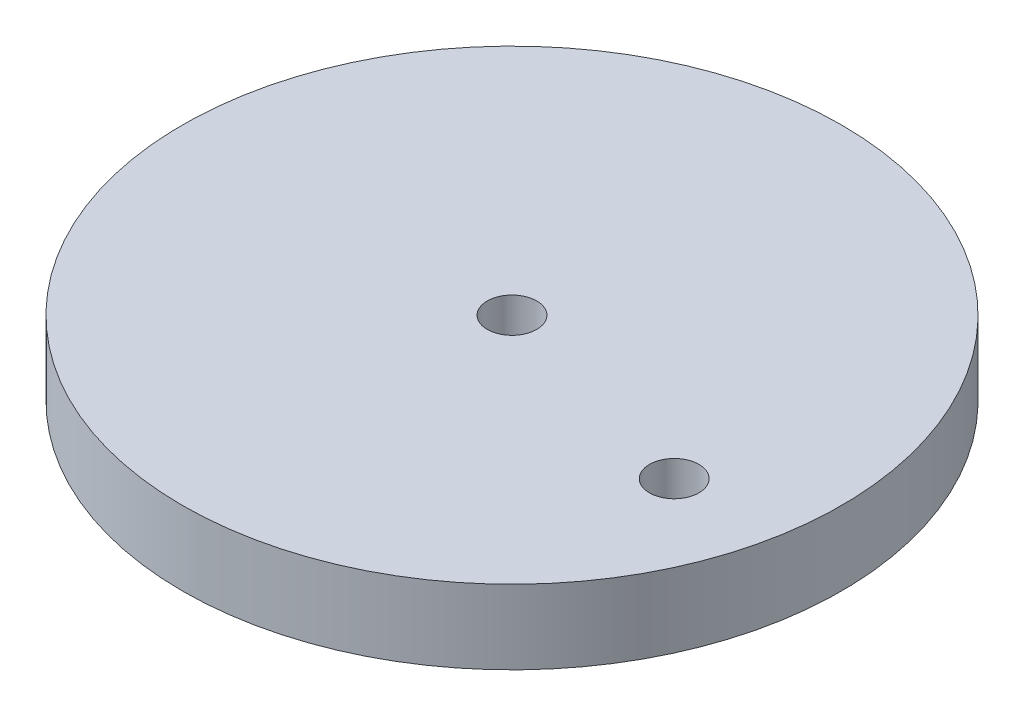
ISO-10303-21;
HEADER;
FILE_DESCRIPTION(('STEP AP214'),'2;1');
FILE_NAME('part.step','',(''),(''),'','','');
FILE_SCHEMA(('AUTOMOTIVE_DESIGN { 1 0 10303 214 1 1 1 1 }'));
ENDSEC;
DATA;
#1=APPLICATION_CONTEXT('core data for automotive mechanical design processes');
#2=APPLICATION_PROTOCOL_DEFINITION('international standard','automotive_design',2000,#1);
#3=PRODUCT_CONTEXT('',#1,'mechanical');
#4=PRODUCT('Part','Part','',(#3));
#5=PRODUCT_RELATED_PRODUCT_CATEGORY('part','',(#4));
#6=PRODUCT_DEFINITION_FORMATION('','',#4);
#7=PRODUCT_DEFINITION_CONTEXT('part definition',#1,'design');
#8=PRODUCT_DEFINITION('design','',#6,#7);
#9=PRODUCT_DEFINITION_SHAPE('','',#8);
#10=(LENGTH_UNIT() NAMED_UNIT(*) SI_UNIT(.MILLI.,.METRE.));
#11=(NAMED_UNIT(*) PLANE_ANGLE_UNIT() SI_UNIT($,.RADIAN.));
#12=(NAMED_UNIT(*) SI_UNIT($,.STERADIAN.) SOLID_ANGLE_UNIT());
#13=UNCERTAINTY_MEASURE_WITH_UNIT(LENGTH_MEASURE(1.E-05),#10,'distance_accuracy_value','');
#14=(GEOMETRIC_REPRESENTATION_CONTEXT(3) GLOBAL_UNCERTAINTY_ASSIGNED_CONTEXT((#13)) GLOBAL_UNIT_ASSIGNED_CONTEXT((#10,
#11,#12)) REPRESENTATION_CONTEXT('',''));
#15=CARTESIAN_POINT('',(0.,0.,0.));
#16=DIRECTION('',(0.,0.,1.));
#17=DIRECTION('',(1.,0.,0.));
#18=AXIS2_PLACEMENT_3D('',#15,#16,#17);
#19=CARTESIAN_POINT('',(0.,2.25,0.));
#20=DIRECTION('',(0.,1.,0.));
#21=DIRECTION('',(0.,0.,1.));
#22=AXIS2_PLACEMENT_3D('',#19,#20,#21);
#23=PLANE('',#22);
#24=CARTESIAN_POINT('',(0.,2.25,0.));
#25=DIRECTION('',(0.,1.,0.));
#26=DIRECTION('',(0.,0.,1.));
#27=AXIS2_PLACEMENT_3D('',#24,#25,#26);
#28=CIRCLE('',#27,1.5);
#29=CARTESIAN_POINT('',(0.,2.25,1.5));
#30=VERTEX_POINT('',#29);
#31=EDGE_CURVE('E42',#30,#30,#28,.T.);
#32=ORIENTED_EDGE('',*,*,#31,.F.);
#33=EDGE_LOOP('',(#32));
#34=FACE_BOUND('',#33,.T.);
#35=CARTESIAN_POINT('',(0.,2.25,0.));
#36=DIRECTION('',(0.,1.,0.));
#37=DIRECTION('',(0.,0.,1.));
#38=AXIS2_PLACEMENT_3D('',#35,#36,#37);
#39=CIRCLE('',#38,20.);
#40=CARTESIAN_POINT('',(0.,2.25,20.));
#41=VERTEX_POINT('',#40);
#42=EDGE_CURVE('E10',#41,#41,#39,.T.);
#43=ORIENTED_EDGE('',*,*,#42,.T.);
#44=EDGE_LOOP('',(#43));
#45=FACE_BOUND('',#44,.T.);
#46=CARTESIAN_POINT('',(13.510919599545,2.25,3.66811280832929));
#47=DIRECTION('',(0.,1.,0.));
#48=DIRECTION('',(0.,0.,1.));
#49=AXIS2_PLACEMENT_3D('',#46,#47,#48);
#50=CIRCLE('',#49,1.5);
#51=CARTESIAN_POINT('',(13.510919599545,2.25,5.1681128083293));
#52=VERTEX_POINT('',#51);
#53=EDGE_CURVE('E47',#52,#52,#50,.T.);
#54=ORIENTED_EDGE('',*,*,#53,.F.);
#55=EDGE_LOOP('',(#54));
#56=FACE_BOUND('',#55,.T.);
#57=ADVANCED_FACE('F31',(#34,#45,#56),#23,.T.);
#58=CARTESIAN_POINT('',(0.,-2.25,0.));
#59=DIRECTION('',(0.,1.,0.));
#60=DIRECTION('',(0.,0.,1.));
#61=AXIS2_PLACEMENT_3D('',#58,#59,#60);
#62=PLANE('',#61);
#63=CARTESIAN_POINT('',(0.,-2.25,0.));
#64=DIRECTION('',(0.,1.,0.));
#65=DIRECTION('',(0.,0.,1.));
#66=AXIS2_PLACEMENT_3D('',#63,#64,#65);
#67=CIRCLE('',#66,20.);
#68=CARTESIAN_POINT('',(0.,-2.25,20.));
#69=VERTEX_POINT('',#68);
#70=EDGE_CURVE('E35',#69,#69,#67,.T.);
#71=ORIENTED_EDGE('',*,*,#70,.F.);
#72=EDGE_LOOP('',(#71));
#73=FACE_BOUND('',#72,.T.);
#74=CARTESIAN_POINT('',(0.,-2.25,0.));
#75=DIRECTION('',(0.,1.,0.));
#76=DIRECTION('',(0.,0.,1.));
#77=AXIS2_PLACEMENT_3D('',#74,#75,#76);
#78=CIRCLE('',#77,1.5);
#79=CARTESIAN_POINT('',(0.,-2.25,1.5));
#80=VERTEX_POINT('',#79);
#81=EDGE_CURVE('E44',#80,#80,#78,.T.);
#82=ORIENTED_EDGE('',*,*,#81,.T.);
#83=EDGE_LOOP('',(#82));
#84=FACE_BOUND('',#83,.T.);
#85=CARTESIAN_POINT('',(13.510919599545,-2.25,3.66811280832929));
#86=DIRECTION('',(0.,1.,0.));
#87=DIRECTION('',(0.,0.,1.));
#88=AXIS2_PLACEMENT_3D('',#85,#86,#87);
#89=CIRCLE('',#88,1.5);
#90=CARTESIAN_POINT('',(13.510919599545,-2.25,5.1681128083293));
#91=VERTEX_POINT('',#90);
#92=EDGE_CURVE('E50',#91,#91,#89,.T.);
#93=ORIENTED_EDGE('',*,*,#92,.T.);
#94=EDGE_LOOP('',(#93));
#95=FACE_BOUND('',#94,.T.);
#96=ADVANCED_FACE('F60',(#73,#84,#95),#62,.F.);
#97=CARTESIAN_POINT('',(0.,2.25,0.));
#98=DIRECTION('',(0.,-1.,0.));
#99=DIRECTION('',(0.,0.,-1.));
#100=AXIS2_PLACEMENT_3D('',#97,#98,#99);
#101=CYLINDRICAL_SURFACE('',#100,20.);
#102=ORIENTED_EDGE('',*,*,#42,.F.);
#103=EDGE_LOOP('',(#102));
#104=FACE_BOUND('',#103,.T.);
#105=ORIENTED_EDGE('',*,*,#70,.T.);
#106=EDGE_LOOP('',(#105));
#107=FACE_BOUND('',#106,.T.);
#108=ADVANCED_FACE('F33',(#104,#107),#101,.T.);
#109=CARTESIAN_POINT('',(0.,2.25,0.));
#110=DIRECTION('',(0.,-1.,0.));
#111=DIRECTION('',(0.,0.,-1.));
#112=AXIS2_PLACEMENT_3D('',#109,#110,#111);
#113=CYLINDRICAL_SURFACE('',#112,1.5);
#114=ORIENTED_EDGE('',*,*,#31,.T.);
#115=EDGE_LOOP('',(#114));
#116=FACE_BOUND('',#115,.T.);
#117=ORIENTED_EDGE('',*,*,#81,.F.);
#118=EDGE_LOOP('',(#117));
#119=FACE_BOUND('',#118,.T.);
#120=ADVANCED_FACE('F69',(#116,#119),#113,.F.);
#121=CARTESIAN_POINT('',(13.510919599545,2.25,3.66811280832929));
#122=DIRECTION('',(0.,-1.,0.));
#123=DIRECTION('',(0.,0.,-1.));
#124=AXIS2_PLACEMENT_3D('',#121,#122,#123);
#125=CYLINDRICAL_SURFACE('',#124,1.5);
#126=ORIENTED_EDGE('',*,*,#53,.T.);
#127=EDGE_LOOP('',(#126));
#128=FACE_BOUND('',#127,.T.);
#129=ORIENTED_EDGE('',*,*,#92,.F.);
#130=EDGE_LOOP('',(#129));
#131=FACE_BOUND('',#130,.T.);
#132=ADVANCED_FACE('F56',(#128,#131),#125,.F.);
#133=CLOSED_SHELL('',(#57,#96,#108,#120,#132));
#134=MANIFOLD_SOLID_BREP('B2',#133);
#135=ADVANCED_BREP_SHAPE_REPRESENTATION('',(#18,#134),#14);
#136=SHAPE_DEFINITION_REPRESENTATION(#9,#135);
ENDSEC;
END-ISO-10303-21;
